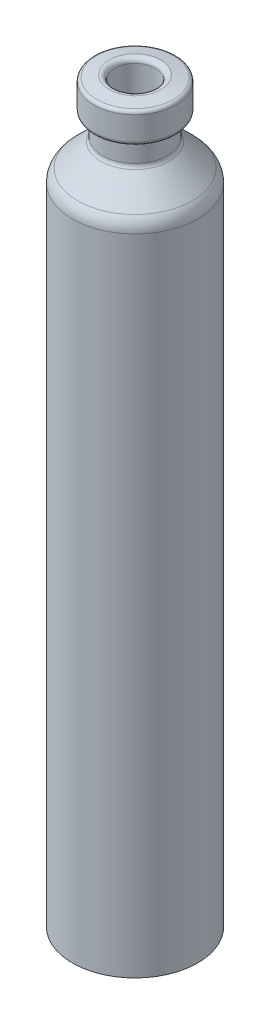
ISO-10303-21;
HEADER;
FILE_DESCRIPTION(('STEP AP214'),'2;1');
FILE_NAME('part.step','',(''),(''),'','','');
FILE_SCHEMA(('AUTOMOTIVE_DESIGN { 1 0 10303 214 1 1 1 1 }'));
ENDSEC;
DATA;
#1=APPLICATION_CONTEXT('core data for automotive mechanical design processes');
#2=APPLICATION_PROTOCOL_DEFINITION('international standard','automotive_design',2000,#1);
#3=PRODUCT_CONTEXT('',#1,'mechanical');
#4=PRODUCT('Part','Part','',(#3));
#5=PRODUCT_RELATED_PRODUCT_CATEGORY('part','',(#4));
#6=PRODUCT_DEFINITION_FORMATION('','',#4);
#7=PRODUCT_DEFINITION_CONTEXT('part definition',#1,'design');
#8=PRODUCT_DEFINITION('design','',#6,#7);
#9=PRODUCT_DEFINITION_SHAPE('','',#8);
#10=(LENGTH_UNIT() NAMED_UNIT(*) SI_UNIT(.MILLI.,.METRE.));
#11=(NAMED_UNIT(*) PLANE_ANGLE_UNIT() SI_UNIT($,.RADIAN.));
#12=(NAMED_UNIT(*) SI_UNIT($,.STERADIAN.) SOLID_ANGLE_UNIT());
#13=UNCERTAINTY_MEASURE_WITH_UNIT(LENGTH_MEASURE(1.E-05),#10,'distance_accuracy_value','');
#14=(GEOMETRIC_REPRESENTATION_CONTEXT(3) GLOBAL_UNCERTAINTY_ASSIGNED_CONTEXT((#13)) GLOBAL_UNIT_ASSIGNED_CONTEXT((#10,
#11,#12)) REPRESENTATION_CONTEXT('',''));
#15=CARTESIAN_POINT('',(0.,0.,0.));
#16=DIRECTION('',(0.,0.,1.));
#17=DIRECTION('',(1.,0.,0.));
#18=AXIS2_PLACEMENT_3D('',#15,#16,#17);
#19=CARTESIAN_POINT('',(0.,0.,0.85));
#20=DIRECTION('',(0.,-1.,0.));
#21=DIRECTION('',(0.,0.,-1.));
#22=AXIS2_PLACEMENT_3D('',#19,#20,#21);
#23=PLANE('',#22);
#24=CARTESIAN_POINT('',(0.,0.,5.475));
#25=DIRECTION('',(0.,-1.,0.));
#26=DIRECTION('',(0.,0.,-1.));
#27=AXIS2_PLACEMENT_3D('',#24,#25,#26);
#28=CIRCLE('',#27,5.475);
#29=CARTESIAN_POINT('',(0.,0.,0.));
#30=VERTEX_POINT('',#29);
#31=EDGE_CURVE('E10',#30,#30,#28,.T.);
#32=ORIENTED_EDGE('',*,*,#31,.T.);
#33=EDGE_LOOP('',(#32));
#34=FACE_BOUND('',#33,.T.);
#35=CARTESIAN_POINT('',(0.,0.,5.475));
#36=DIRECTION('',(0.,-1.,0.));
#37=DIRECTION('',(0.,0.,-1.));
#38=AXIS2_PLACEMENT_3D('',#35,#36,#37);
#39=CIRCLE('',#38,4.625);
#40=CARTESIAN_POINT('',(0.,0.,0.85));
#41=VERTEX_POINT('',#40);
#42=EDGE_CURVE('E116',#41,#41,#39,.T.);
#43=ORIENTED_EDGE('',*,*,#42,.F.);
#44=EDGE_LOOP('',(#43));
#45=FACE_BOUND('',#44,.T.);
#46=ADVANCED_FACE('F41',(#34,#45),#23,.T.);
#47=CARTESIAN_POINT('',(0.,0.,5.475));
#48=DIRECTION('',(0.,-1.,0.));
#49=DIRECTION('',(0.,0.,-1.));
#50=AXIS2_PLACEMENT_3D('',#47,#48,#49);
#51=CYLINDRICAL_SURFACE('',#50,5.475);
#52=CARTESIAN_POINT('',(0.,56.2827693881703,5.475));
#53=DIRECTION('',(0.,-1.,0.));
#54=DIRECTION('',(0.,0.,-1.));
#55=AXIS2_PLACEMENT_3D('',#52,#53,#54);
#56=CIRCLE('',#55,5.475);
#57=CARTESIAN_POINT('',(0.,56.2827693881703,0.));
#58=VERTEX_POINT('',#57);
#59=EDGE_CURVE('E48',#58,#58,#56,.T.);
#60=ORIENTED_EDGE('',*,*,#59,.T.);
#61=EDGE_LOOP('',(#60));
#62=FACE_BOUND('',#61,.T.);
#63=ORIENTED_EDGE('',*,*,#31,.F.);
#64=EDGE_LOOP('',(#63));
#65=FACE_BOUND('',#64,.T.);
#66=ADVANCED_FACE('F125',(#62,#65),#51,.T.);
#67=CARTESIAN_POINT('',(0.,56.2827693881703,5.475));
#68=DIRECTION('',(0.,-1.,0.));
#69=DIRECTION('',(0.,0.,-1.));
#70=AXIS2_PLACEMENT_3D('',#67,#68,#69);
#71=TOROIDAL_SURFACE('',#70,3.875,1.6);
#72=CARTESIAN_POINT('',(0.,57.4195404836065,5.475));
#73=DIRECTION('',(0.,-1.,0.));
#74=DIRECTION('',(0.,0.,-1.));
#75=AXIS2_PLACEMENT_3D('',#72,#73,#74);
#76=CIRCLE('',#75,5.00094470405111);
#77=CARTESIAN_POINT('',(0.,57.4195404836065,0.47405529594889));
#78=VERTEX_POINT('',#77);
#79=EDGE_CURVE('E53',#78,#78,#76,.T.);
#80=ORIENTED_EDGE('',*,*,#79,.T.);
#81=EDGE_LOOP('',(#80));
#82=FACE_BOUND('',#81,.T.);
#83=ORIENTED_EDGE('',*,*,#59,.F.);
#84=EDGE_LOOP('',(#83));
#85=FACE_BOUND('',#84,.T.);
#86=ADVANCED_FACE('F129',(#82,#85),#71,.T.);
#87=CARTESIAN_POINT('',(0.,57.4195404836065,5.475));
#88=DIRECTION('',(0.,-1.,0.));
#89=DIRECTION('',(0.,0.,-1.));
#90=AXIS2_PLACEMENT_3D('',#87,#88,#89);
#91=CONICAL_SURFACE('',#90,5.00094470405111,0.790182815880807);
#92=CARTESIAN_POINT('',(0.,59.403268598873,5.475));
#93=DIRECTION('',(0.,-1.,0.));
#94=DIRECTION('',(0.,0.,-1.));
#95=AXIS2_PLACEMENT_3D('',#92,#93,#94);
#96=CIRCLE('',#95,2.99814227998402);
#97=CARTESIAN_POINT('',(0.,59.403268598873,2.47685772001598));
#98=VERTEX_POINT('',#97);
#99=EDGE_CURVE('E58',#98,#98,#96,.T.);
#100=ORIENTED_EDGE('',*,*,#99,.T.);
#101=EDGE_LOOP('',(#100));
#102=FACE_BOUND('',#101,.T.);
#103=ORIENTED_EDGE('',*,*,#79,.F.);
#104=EDGE_LOOP('',(#103));
#105=FACE_BOUND('',#104,.T.);
#106=ADVANCED_FACE('F133',(#102,#105),#91,.T.);
#107=CARTESIAN_POINT('',(0.,59.7585095661968,5.475));
#108=DIRECTION('',(0.,-1.,0.));
#109=DIRECTION('',(0.,0.,-1.));
#110=AXIS2_PLACEMENT_3D('',#107,#108,#109);
#111=TOROIDAL_SURFACE('',#110,3.34999999999999,0.500000000000002);
#112=CARTESIAN_POINT('',(0.,59.7585095661968,5.475));
#113=DIRECTION('',(0.,-1.,0.));
#114=DIRECTION('',(0.,0.,-1.));
#115=AXIS2_PLACEMENT_3D('',#112,#113,#114);
#116=CIRCLE('',#115,2.84999999999999);
#117=CARTESIAN_POINT('',(0.,59.7585095661968,2.62500000000001));
#118=VERTEX_POINT('',#117);
#119=EDGE_CURVE('E64',#118,#118,#116,.T.);
#120=ORIENTED_EDGE('',*,*,#119,.T.);
#121=EDGE_LOOP('',(#120));
#122=FACE_BOUND('',#121,.T.);
#123=ORIENTED_EDGE('',*,*,#99,.F.);
#124=EDGE_LOOP('',(#123));
#125=FACE_BOUND('',#124,.T.);
#126=ADVANCED_FACE('F140',(#122,#125),#111,.F.);
#127=CARTESIAN_POINT('',(0.,0.,5.475));
#128=DIRECTION('',(0.,-1.,0.));
#129=DIRECTION('',(0.,0.,-1.));
#130=AXIS2_PLACEMENT_3D('',#127,#128,#129);
#131=CYLINDRICAL_SURFACE('',#130,2.84999999999999);
#132=CARTESIAN_POINT('',(0.,61.2255387390937,5.475));
#133=DIRECTION('',(0.,-1.,0.));
#134=DIRECTION('',(0.,0.,-1.));
#135=AXIS2_PLACEMENT_3D('',#132,#133,#134);
#136=CIRCLE('',#135,2.84999999999999);
#137=CARTESIAN_POINT('',(0.,61.2255387390937,2.625));
#138=VERTEX_POINT('',#137);
#139=EDGE_CURVE('E68',#138,#138,#136,.T.);
#140=ORIENTED_EDGE('',*,*,#139,.T.);
#141=EDGE_LOOP('',(#140));
#142=FACE_BOUND('',#141,.T.);
#143=ORIENTED_EDGE('',*,*,#119,.F.);
#144=EDGE_LOOP('',(#143));
#145=FACE_BOUND('',#144,.T.);
#146=ADVANCED_FACE('F144',(#142,#145),#131,.T.);
#147=CARTESIAN_POINT('',(0.,61.2255387390937,5.475));
#148=DIRECTION('',(0.,-1.,0.));
#149=DIRECTION('',(0.,0.,-1.));
#150=AXIS2_PLACEMENT_3D('',#147,#148,#149);
#151=TOROIDAL_SURFACE('',#150,3.15,0.300000000000008);
#152=CARTESIAN_POINT('',(0.,61.5153164869805,5.475));
#153=DIRECTION('',(0.,-1.,0.));
#154=DIRECTION('',(0.,0.,-1.));
#155=AXIS2_PLACEMENT_3D('',#152,#153,#154);
#156=CIRCLE('',#155,3.07235428646924);
#157=CARTESIAN_POINT('',(0.,61.5153164869805,2.40264571353076));
#158=VERTEX_POINT('',#157);
#159=EDGE_CURVE('E72',#158,#158,#156,.T.);
#160=ORIENTED_EDGE('',*,*,#159,.T.);
#161=EDGE_LOOP('',(#160));
#162=FACE_BOUND('',#161,.T.);
#163=ORIENTED_EDGE('',*,*,#139,.F.);
#164=EDGE_LOOP('',(#163));
#165=FACE_BOUND('',#164,.T.);
#166=ADVANCED_FACE('F148',(#162,#165),#151,.F.);
#167=CARTESIAN_POINT('',(0.,61.5153164869805,5.475));
#168=DIRECTION('',(0.,1.,0.));
#169=DIRECTION('',(0.,0.,1.));
#170=AXIS2_PLACEMENT_3D('',#167,#168,#169);
#171=CONICAL_SURFACE('',#170,3.07235428646924,1.30899693899574);
#172=CARTESIAN_POINT('',(0.,61.590420348507,5.475));
#173=DIRECTION('',(0.,-1.,0.));
#174=DIRECTION('',(0.,0.,-1.));
#175=AXIS2_PLACEMENT_3D('',#172,#173,#174);
#176=CIRCLE('',#175,3.35264571353075);
#177=CARTESIAN_POINT('',(0.,61.590420348507,2.12235428646925));
#178=VERTEX_POINT('',#177);
#179=EDGE_CURVE('E76',#178,#178,#176,.T.);
#180=ORIENTED_EDGE('',*,*,#179,.T.);
#181=EDGE_LOOP('',(#180));
#182=FACE_BOUND('',#181,.T.);
#183=ORIENTED_EDGE('',*,*,#159,.F.);
#184=EDGE_LOOP('',(#183));
#185=FACE_BOUND('',#184,.T.);
#186=ADVANCED_FACE('F152',(#182,#185),#171,.T.);
#187=CARTESIAN_POINT('',(0.,61.8801980963937,5.475));
#188=DIRECTION('',(0.,-1.,0.));
#189=DIRECTION('',(0.,0.,-1.));
#190=AXIS2_PLACEMENT_3D('',#187,#188,#189);
#191=TOROIDAL_SURFACE('',#190,3.275,0.300000000000001);
#192=CARTESIAN_POINT('',(0.,61.8801980963937,5.475));
#193=DIRECTION('',(0.,-1.,0.));
#194=DIRECTION('',(0.,0.,-1.));
#195=AXIS2_PLACEMENT_3D('',#192,#193,#194);
#196=CIRCLE('',#195,3.575);
#197=CARTESIAN_POINT('',(0.,61.8801980963937,1.9));
#198=VERTEX_POINT('',#197);
#199=EDGE_CURVE('E80',#198,#198,#196,.T.);
#200=ORIENTED_EDGE('',*,*,#199,.T.);
#201=EDGE_LOOP('',(#200));
#202=FACE_BOUND('',#201,.T.);
#203=ORIENTED_EDGE('',*,*,#179,.F.);
#204=EDGE_LOOP('',(#203));
#205=FACE_BOUND('',#204,.T.);
#206=ADVANCED_FACE('F156',(#202,#205),#191,.T.);
#207=CARTESIAN_POINT('',(0.,0.,5.475));
#208=DIRECTION('',(0.,-1.,0.));
#209=DIRECTION('',(0.,0.,-1.));
#210=AXIS2_PLACEMENT_3D('',#207,#208,#209);
#211=CYLINDRICAL_SURFACE('',#210,3.575);
#212=CARTESIAN_POINT('',(0.,63.9528145278069,5.475));
#213=DIRECTION('',(0.,-1.,0.));
#214=DIRECTION('',(0.,0.,-1.));
#215=AXIS2_PLACEMENT_3D('',#212,#213,#214);
#216=CIRCLE('',#215,3.575);
#217=CARTESIAN_POINT('',(0.,63.9528145278069,1.9));
#218=VERTEX_POINT('',#217);
#219=EDGE_CURVE('E84',#218,#218,#216,.T.);
#220=ORIENTED_EDGE('',*,*,#219,.T.);
#221=EDGE_LOOP('',(#220));
#222=FACE_BOUND('',#221,.T.);
#223=ORIENTED_EDGE('',*,*,#199,.F.);
#224=EDGE_LOOP('',(#223));
#225=FACE_BOUND('',#224,.T.);
#226=ADVANCED_FACE('F160',(#222,#225),#211,.T.);
#227=CARTESIAN_POINT('',(0.,63.9528145278069,5.475));
#228=DIRECTION('',(0.,-1.,0.));
#229=DIRECTION('',(0.,0.,-1.));
#230=AXIS2_PLACEMENT_3D('',#227,#228,#229);
#231=TOROIDAL_SURFACE('',#230,3.275,0.300000000000008);
#232=CARTESIAN_POINT('',(0.,64.2473026828412,5.475));
#233=DIRECTION('',(0.,-1.,0.));
#234=DIRECTION('',(0.,0.,-1.));
#235=AXIS2_PLACEMENT_3D('',#232,#233,#234);
#236=CIRCLE('',#235,3.33224269861297);
#237=CARTESIAN_POINT('',(0.,64.2473026828412,2.14275730138703));
#238=VERTEX_POINT('',#237);
#239=EDGE_CURVE('E88',#238,#238,#236,.T.);
#240=ORIENTED_EDGE('',*,*,#239,.T.);
#241=EDGE_LOOP('',(#240));
#242=FACE_BOUND('',#241,.T.);
#243=ORIENTED_EDGE('',*,*,#219,.F.);
#244=EDGE_LOOP('',(#243));
#245=FACE_BOUND('',#244,.T.);
#246=ADVANCED_FACE('F164',(#242,#245),#231,.T.);
#247=CARTESIAN_POINT('',(0.,64.2473026828412,5.475));
#248=DIRECTION('',(0.,-1.,0.));
#249=DIRECTION('',(0.,0.,-1.));
#250=AXIS2_PLACEMENT_3D('',#247,#248,#249);
#251=CONICAL_SURFACE('',#250,3.33224269861297,1.37881010907551);
#252=CARTESIAN_POINT('',(0.,64.4574120717419,5.475));
#253=DIRECTION('',(0.,-1.,0.));
#254=DIRECTION('',(0.,0.,-1.));
#255=AXIS2_PLACEMENT_3D('',#252,#253,#254);
#256=CIRCLE('',#255,2.25132359815062);
#257=CARTESIAN_POINT('',(0.,64.4574120717419,3.22367640184938));
#258=VERTEX_POINT('',#257);
#259=EDGE_CURVE('E92',#258,#258,#256,.T.);
#260=ORIENTED_EDGE('',*,*,#259,.T.);
#261=EDGE_LOOP('',(#260));
#262=FACE_BOUND('',#261,.T.);
#263=ORIENTED_EDGE('',*,*,#239,.F.);
#264=EDGE_LOOP('',(#263));
#265=FACE_BOUND('',#264,.T.);
#266=ADVANCED_FACE('F168',(#262,#265),#251,.T.);
#267=CARTESIAN_POINT('',(0.,64.0647611983628,5.475));
#268=DIRECTION('',(0.,-1.,0.));
#269=DIRECTION('',(0.,0.,-1.));
#270=AXIS2_PLACEMENT_3D('',#267,#268,#269);
#271=TOROIDAL_SURFACE('',#270,2.175,0.400000000000003);
#272=CARTESIAN_POINT('',(0.,64.0647611983628,5.475));
#273=DIRECTION('',(0.,-1.,0.));
#274=DIRECTION('',(0.,0.,-1.));
#275=AXIS2_PLACEMENT_3D('',#272,#273,#274);
#276=CIRCLE('',#275,1.775);
#277=CARTESIAN_POINT('',(0.,64.0647611983628,3.7));
#278=VERTEX_POINT('',#277);
#279=EDGE_CURVE('E96',#278,#278,#276,.T.);
#280=ORIENTED_EDGE('',*,*,#279,.T.);
#281=EDGE_LOOP('',(#280));
#282=FACE_BOUND('',#281,.T.);
#283=ORIENTED_EDGE('',*,*,#259,.F.);
#284=EDGE_LOOP('',(#283));
#285=FACE_BOUND('',#284,.T.);
#286=ADVANCED_FACE('F172',(#282,#285),#271,.T.);
#287=CARTESIAN_POINT('',(0.,0.,5.475));
#288=DIRECTION('',(0.,-1.,0.));
#289=DIRECTION('',(0.,0.,-1.));
#290=AXIS2_PLACEMENT_3D('',#287,#288,#289);
#291=CYLINDRICAL_SURFACE('',#290,1.775);
#292=CARTESIAN_POINT('',(0.,59.4157761480889,5.475));
#293=DIRECTION('',(0.,-1.,0.));
#294=DIRECTION('',(0.,0.,-1.));
#295=AXIS2_PLACEMENT_3D('',#292,#293,#294);
#296=CIRCLE('',#295,1.775);
#297=CARTESIAN_POINT('',(0.,59.4157761480889,3.7));
#298=VERTEX_POINT('',#297);
#299=EDGE_CURVE('E100',#298,#298,#296,.T.);
#300=ORIENTED_EDGE('',*,*,#299,.T.);
#301=EDGE_LOOP('',(#300));
#302=FACE_BOUND('',#301,.T.);
#303=ORIENTED_EDGE('',*,*,#279,.F.);
#304=EDGE_LOOP('',(#303));
#305=FACE_BOUND('',#304,.T.);
#306=ADVANCED_FACE('F176',(#302,#305),#291,.F.);
#307=CARTESIAN_POINT('',(0.,59.4157761480889,5.475));
#308=DIRECTION('',(0.,-1.,0.));
#309=DIRECTION('',(0.,0.,-1.));
#310=AXIS2_PLACEMENT_3D('',#307,#308,#309);
#311=TOROIDAL_SURFACE('',#310,2.275,0.500000000000001);
#312=CARTESIAN_POINT('',(0.,59.0605351807651,5.475));
#313=DIRECTION('',(0.,-1.,0.));
#314=DIRECTION('',(0.,0.,-1.));
#315=AXIS2_PLACEMENT_3D('',#312,#313,#314);
#316=CIRCLE('',#315,1.92314227998403);
#317=CARTESIAN_POINT('',(0.,59.0605351807651,3.55185772001597));
#318=VERTEX_POINT('',#317);
#319=EDGE_CURVE('E104',#318,#318,#316,.T.);
#320=ORIENTED_EDGE('',*,*,#319,.T.);
#321=EDGE_LOOP('',(#320));
#322=FACE_BOUND('',#321,.T.);
#323=ORIENTED_EDGE('',*,*,#299,.F.);
#324=EDGE_LOOP('',(#323));
#325=FACE_BOUND('',#324,.T.);
#326=ADVANCED_FACE('F180',(#322,#325),#311,.T.);
#327=CARTESIAN_POINT('',(0.,59.0605351807651,5.475));
#328=DIRECTION('',(0.,-1.,0.));
#329=DIRECTION('',(0.,0.,-1.));
#330=AXIS2_PLACEMENT_3D('',#327,#328,#329);
#331=CONICAL_SURFACE('',#330,1.92314227998403,0.790182815880809);
#332=CARTESIAN_POINT('',(0.,56.8539499226415,5.475));
#333=DIRECTION('',(0.,-1.,0.));
#334=DIRECTION('',(0.,0.,-1.));
#335=AXIS2_PLACEMENT_3D('',#332,#333,#334);
#336=CIRCLE('',#335,4.15094470405111);
#337=CARTESIAN_POINT('',(0.,56.8539499226415,1.32405529594889));
#338=VERTEX_POINT('',#337);
#339=EDGE_CURVE('E108',#338,#338,#336,.T.);
#340=ORIENTED_EDGE('',*,*,#339,.T.);
#341=EDGE_LOOP('',(#340));
#342=FACE_BOUND('',#341,.T.);
#343=ORIENTED_EDGE('',*,*,#319,.F.);
#344=EDGE_LOOP('',(#343));
#345=FACE_BOUND('',#344,.T.);
#346=ADVANCED_FACE('F184',(#342,#345),#331,.F.);
#347=CARTESIAN_POINT('',(0.,55.7171788272053,5.475));
#348=DIRECTION('',(0.,-1.,0.));
#349=DIRECTION('',(0.,0.,-1.));
#350=AXIS2_PLACEMENT_3D('',#347,#348,#349);
#351=TOROIDAL_SURFACE('',#350,3.025,1.6);
#352=CARTESIAN_POINT('',(0.,55.7171788272053,5.475));
#353=DIRECTION('',(0.,-1.,0.));
#354=DIRECTION('',(0.,0.,-1.));
#355=AXIS2_PLACEMENT_3D('',#352,#353,#354);
#356=CIRCLE('',#355,4.625);
#357=CARTESIAN_POINT('',(0.,55.7171788272053,0.850000000000001));
#358=VERTEX_POINT('',#357);
#359=EDGE_CURVE('E112',#358,#358,#356,.T.);
#360=ORIENTED_EDGE('',*,*,#359,.T.);
#361=EDGE_LOOP('',(#360));
#362=FACE_BOUND('',#361,.T.);
#363=ORIENTED_EDGE('',*,*,#339,.F.);
#364=EDGE_LOOP('',(#363));
#365=FACE_BOUND('',#364,.T.);
#366=ADVANCED_FACE('F188',(#362,#365),#351,.F.);
#367=CARTESIAN_POINT('',(0.,0.,5.475));
#368=DIRECTION('',(0.,-1.,0.));
#369=DIRECTION('',(0.,0.,-1.));
#370=AXIS2_PLACEMENT_3D('',#367,#368,#369);
#371=CYLINDRICAL_SURFACE('',#370,4.625);
#372=ORIENTED_EDGE('',*,*,#42,.T.);
#373=EDGE_LOOP('',(#372));
#374=FACE_BOUND('',#373,.T.);
#375=ORIENTED_EDGE('',*,*,#359,.F.);
#376=EDGE_LOOP('',(#375));
#377=FACE_BOUND('',#376,.T.);
#378=ADVANCED_FACE('F121',(#374,#377),#371,.F.);
#379=CLOSED_SHELL('',(#46,#66,#86,#106,#126,#146,#166,#186,#206,#226,#246,#266,#286,#306,#326,
#346,#366,#378));
#380=MANIFOLD_SOLID_BREP('B2',#379);
#381=ADVANCED_BREP_SHAPE_REPRESENTATION('',(#18,#380),#14);
#382=SHAPE_DEFINITION_REPRESENTATION(#9,#381);
ENDSEC;
END-ISO-10303-21;
